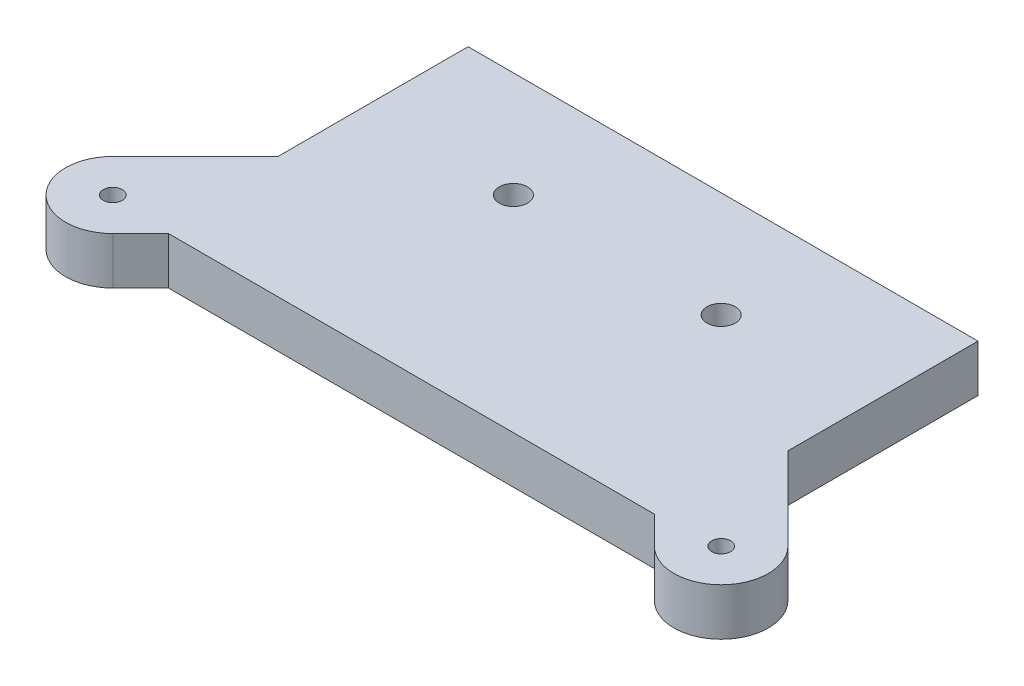
ISO-10303-21;
HEADER;
FILE_DESCRIPTION(('STEP AP214'),'2;1');
FILE_NAME('part.step','',(''),(''),'','','');
FILE_SCHEMA(('AUTOMOTIVE_DESIGN { 1 0 10303 214 1 1 1 1 }'));
ENDSEC;
DATA;
#1=APPLICATION_CONTEXT('core data for automotive mechanical design processes');
#2=APPLICATION_PROTOCOL_DEFINITION('international standard','automotive_design',2000,#1);
#3=PRODUCT_CONTEXT('',#1,'mechanical');
#4=PRODUCT('Part','Part','',(#3));
#5=PRODUCT_RELATED_PRODUCT_CATEGORY('part','',(#4));
#6=PRODUCT_DEFINITION_FORMATION('','',#4);
#7=PRODUCT_DEFINITION_CONTEXT('part definition',#1,'design');
#8=PRODUCT_DEFINITION('design','',#6,#7);
#9=PRODUCT_DEFINITION_SHAPE('','',#8);
#10=(LENGTH_UNIT() NAMED_UNIT(*) SI_UNIT(.MILLI.,.METRE.));
#11=(NAMED_UNIT(*) PLANE_ANGLE_UNIT() SI_UNIT($,.RADIAN.));
#12=(NAMED_UNIT(*) SI_UNIT($,.STERADIAN.) SOLID_ANGLE_UNIT());
#13=UNCERTAINTY_MEASURE_WITH_UNIT(LENGTH_MEASURE(1.E-05),#10,'distance_accuracy_value','');
#14=(GEOMETRIC_REPRESENTATION_CONTEXT(3) GLOBAL_UNCERTAINTY_ASSIGNED_CONTEXT((#13)) GLOBAL_UNIT_ASSIGNED_CONTEXT((#10,
#11,#12)) REPRESENTATION_CONTEXT('',''));
#15=CARTESIAN_POINT('',(0.,0.,0.));
#16=DIRECTION('',(0.,0.,1.));
#17=DIRECTION('',(1.,0.,0.));
#18=AXIS2_PLACEMENT_3D('',#15,#16,#17);
#19=CARTESIAN_POINT('',(0.,5.,0.));
#20=DIRECTION('',(1.,0.,0.));
#21=DIRECTION('',(0.,0.,-1.));
#22=AXIS2_PLACEMENT_3D('',#19,#20,#21);
#23=PLANE('',#22);
#24=DIRECTION('',(0.,0.,1.));
#25=VECTOR('',#24,1.);
#26=CARTESIAN_POINT('',(0.,0.,0.));
#27=LINE('',#26,#25);
#28=CARTESIAN_POINT('',(0.,0.,-33.));
#29=VERTEX_POINT('',#28);
#30=CARTESIAN_POINT('',(0.,0.,-12.8710678118655));
#31=VERTEX_POINT('',#30);
#32=EDGE_CURVE('E201',#29,#31,#27,.T.);
#33=ORIENTED_EDGE('',*,*,#32,.T.);
#34=DIRECTION('',(0.,-1.,0.));
#35=VECTOR('',#34,1.);
#36=CARTESIAN_POINT('',(0.,5.,-12.8710678118655));
#37=LINE('',#36,#35);
#38=CARTESIAN_POINT('',(0.,5.,-12.8710678118655));
#39=VERTEX_POINT('',#38);
#40=EDGE_CURVE('E205',#39,#31,#37,.T.);
#41=ORIENTED_EDGE('',*,*,#40,.F.);
#42=DIRECTION('',(0.,0.,1.));
#43=VECTOR('',#42,1.);
#44=CARTESIAN_POINT('',(0.,5.,0.));
#45=LINE('',#44,#43);
#46=CARTESIAN_POINT('',(0.,5.,-33.));
#47=VERTEX_POINT('',#46);
#48=EDGE_CURVE('E211',#47,#39,#45,.T.);
#49=ORIENTED_EDGE('',*,*,#48,.F.);
#50=DIRECTION('',(0.,-1.,0.));
#51=VECTOR('',#50,1.);
#52=CARTESIAN_POINT('',(0.,5.,-33.));
#53=LINE('',#52,#51);
#54=EDGE_CURVE('E47',#47,#29,#53,.T.);
#55=ORIENTED_EDGE('',*,*,#54,.T.);
#56=EDGE_LOOP('',(#33,#41,#49,#55));
#57=FACE_BOUND('',#56,.T.);
#58=ADVANCED_FACE('F39',(#57),#23,.F.);
#59=CARTESIAN_POINT('',(0.,5.,0.));
#60=DIRECTION('',(0.,0.,-1.));
#61=DIRECTION('',(-1.,0.,0.));
#62=AXIS2_PLACEMENT_3D('',#59,#60,#61);
#63=PLANE('',#62);
#64=DIRECTION('',(1.,0.,0.));
#65=VECTOR('',#64,1.);
#66=CARTESIAN_POINT('',(0.,0.,0.));
#67=LINE('',#66,#65);
#68=CARTESIAN_POINT('',(1.27106781186554,0.,0.));
#69=VERTEX_POINT('',#68);
#70=CARTESIAN_POINT('',(52.7289321881347,0.,0.));
#71=VERTEX_POINT('',#70);
#72=EDGE_CURVE('E226',#69,#71,#67,.T.);
#73=ORIENTED_EDGE('',*,*,#72,.T.);
#74=DIRECTION('',(0.,-1.,0.));
#75=VECTOR('',#74,1.);
#76=CARTESIAN_POINT('',(52.7289321881347,5.,0.));
#77=LINE('',#76,#75);
#78=CARTESIAN_POINT('',(52.7289321881347,5.,0.));
#79=VERTEX_POINT('',#78);
#80=EDGE_CURVE('E62',#79,#71,#77,.T.);
#81=ORIENTED_EDGE('',*,*,#80,.F.);
#82=DIRECTION('',(1.,0.,0.));
#83=VECTOR('',#82,1.);
#84=CARTESIAN_POINT('',(0.,5.,0.));
#85=LINE('',#84,#83);
#86=CARTESIAN_POINT('',(1.27106781186554,5.,0.));
#87=VERTEX_POINT('',#86);
#88=EDGE_CURVE('E215',#87,#79,#85,.T.);
#89=ORIENTED_EDGE('',*,*,#88,.F.);
#90=DIRECTION('',(0.,-1.,0.));
#91=VECTOR('',#90,1.);
#92=CARTESIAN_POINT('',(1.27106781186554,5.,0.));
#93=LINE('',#92,#91);
#94=EDGE_CURVE('E202',#87,#69,#93,.T.);
#95=ORIENTED_EDGE('',*,*,#94,.T.);
#96=EDGE_LOOP('',(#73,#81,#89,#95));
#97=FACE_BOUND('',#96,.T.);
#98=ADVANCED_FACE('F271',(#97),#63,.F.);
#99=CARTESIAN_POINT('',(54.,5.,0.));
#100=DIRECTION('',(-1.,0.,0.));
#101=DIRECTION('',(0.,0.,1.));
#102=AXIS2_PLACEMENT_3D('',#99,#100,#101);
#103=PLANE('',#102);
#104=DIRECTION('',(0.,0.,-1.));
#105=VECTOR('',#104,1.);
#106=CARTESIAN_POINT('',(54.,5.,0.));
#107=LINE('',#106,#105);
#108=CARTESIAN_POINT('',(54.,5.,-12.8710678118657));
#109=VERTEX_POINT('',#108);
#110=CARTESIAN_POINT('',(54.,5.,-33.));
#111=VERTEX_POINT('',#110);
#112=EDGE_CURVE('E54',#109,#111,#107,.T.);
#113=ORIENTED_EDGE('',*,*,#112,.F.);
#114=DIRECTION('',(0.,-1.,0.));
#115=VECTOR('',#114,1.);
#116=CARTESIAN_POINT('',(54.,5.,-12.8710678118657));
#117=LINE('',#116,#115);
#118=CARTESIAN_POINT('',(54.,0.,-12.8710678118657));
#119=VERTEX_POINT('',#118);
#120=EDGE_CURVE('E128',#109,#119,#117,.T.);
#121=ORIENTED_EDGE('',*,*,#120,.T.);
#122=DIRECTION('',(0.,0.,-1.));
#123=VECTOR('',#122,1.);
#124=CARTESIAN_POINT('',(54.,0.,0.));
#125=LINE('',#124,#123);
#126=CARTESIAN_POINT('',(54.,0.,-33.));
#127=VERTEX_POINT('',#126);
#128=EDGE_CURVE('E229',#119,#127,#125,.T.);
#129=ORIENTED_EDGE('',*,*,#128,.T.);
#130=DIRECTION('',(0.,-1.,0.));
#131=VECTOR('',#130,1.);
#132=CARTESIAN_POINT('',(54.,5.,-33.));
#133=LINE('',#132,#131);
#134=EDGE_CURVE('E11',#111,#127,#133,.T.);
#135=ORIENTED_EDGE('',*,*,#134,.F.);
#136=EDGE_LOOP('',(#113,#121,#129,#135));
#137=FACE_BOUND('',#136,.T.);
#138=ADVANCED_FACE('F253',(#137),#103,.F.);
#139=CARTESIAN_POINT('',(0.,5.,-33.));
#140=DIRECTION('',(0.,0.,1.));
#141=DIRECTION('',(1.,0.,0.));
#142=AXIS2_PLACEMENT_3D('',#139,#140,#141);
#143=PLANE('',#142);
#144=DIRECTION('',(-1.,0.,0.));
#145=VECTOR('',#144,1.);
#146=CARTESIAN_POINT('',(0.,0.,-33.));
#147=LINE('',#146,#145);
#148=EDGE_CURVE('E216',#127,#29,#147,.T.);
#149=ORIENTED_EDGE('',*,*,#148,.T.);
#150=ORIENTED_EDGE('',*,*,#54,.F.);
#151=DIRECTION('',(-1.,0.,0.));
#152=VECTOR('',#151,1.);
#153=CARTESIAN_POINT('',(0.,5.,-33.));
#154=LINE('',#153,#152);
#155=EDGE_CURVE('E221',#111,#47,#154,.T.);
#156=ORIENTED_EDGE('',*,*,#155,.F.);
#157=ORIENTED_EDGE('',*,*,#134,.T.);
#158=EDGE_LOOP('',(#149,#150,#156,#157));
#159=FACE_BOUND('',#158,.T.);
#160=ADVANCED_FACE('F252',(#159),#143,.F.);
#161=CARTESIAN_POINT('',(0.,5.,0.));
#162=DIRECTION('',(0.,-1.,0.));
#163=DIRECTION('',(0.,0.,-1.));
#164=AXIS2_PLACEMENT_3D('',#161,#162,#163);
#165=PLANE('',#164);
#166=CARTESIAN_POINT('',(38.,5.,-21.8));
#167=DIRECTION('',(0.,-1.,0.));
#168=DIRECTION('',(0.,0.,-1.));
#169=AXIS2_PLACEMENT_3D('',#166,#167,#168);
#170=CIRCLE('',#169,1.5);
#171=CARTESIAN_POINT('',(38.,5.,-23.3));
#172=VERTEX_POINT('',#171);
#173=EDGE_CURVE('E321',#172,#172,#170,.T.);
#174=ORIENTED_EDGE('',*,*,#173,.T.);
#175=EDGE_LOOP('',(#174));
#176=FACE_BOUND('',#175,.T.);
#177=CARTESIAN_POINT('',(16.,5.,-21.8));
#178=DIRECTION('',(0.,-1.,0.));
#179=DIRECTION('',(0.,0.,-1.));
#180=AXIS2_PLACEMENT_3D('',#177,#178,#179);
#181=CIRCLE('',#180,1.5);
#182=CARTESIAN_POINT('',(16.,5.,-23.3));
#183=VERTEX_POINT('',#182);
#184=EDGE_CURVE('E326',#183,#183,#181,.T.);
#185=ORIENTED_EDGE('',*,*,#184,.T.);
#186=EDGE_LOOP('',(#185));
#187=FACE_BOUND('',#186,.T.);
#188=DIRECTION('',(0.707106781186549,0.,0.707106781186547));
#189=VECTOR('',#188,1.);
#190=CARTESIAN_POINT('',(62.7487373415293,5.,-4.12233047033644));
#191=LINE('',#190,#189);
#192=CARTESIAN_POINT('',(62.7487373415293,5.,-4.12233047033644));
#193=VERTEX_POINT('',#192);
#194=EDGE_CURVE('E135',#109,#193,#191,.T.);
#195=ORIENTED_EDGE('',*,*,#194,.F.);
#196=ORIENTED_EDGE('',*,*,#112,.T.);
#197=ORIENTED_EDGE('',*,*,#155,.T.);
#198=ORIENTED_EDGE('',*,*,#48,.T.);
#199=DIRECTION('',(0.707106781186544,0.,-0.707106781186551));
#200=VECTOR('',#199,1.);
#201=CARTESIAN_POINT('',(-8.74873734152914,5.,-4.12233047033624));
#202=LINE('',#201,#200);
#203=CARTESIAN_POINT('',(-8.74873734152914,5.,-4.12233047033624));
#204=VERTEX_POINT('',#203);
#205=EDGE_CURVE('E178',#204,#39,#202,.T.);
#206=ORIENTED_EDGE('',*,*,#205,.F.);
#207=CARTESIAN_POINT('',(-5.21320343559638,5.,-0.586796564403524));
#208=DIRECTION('',(0.,-1.,0.));
#209=DIRECTION('',(0.,0.,-1.));
#210=AXIS2_PLACEMENT_3D('',#207,#208,#209);
#211=CIRCLE('',#210,5.);
#212=CARTESIAN_POINT('',(-1.67766952966347,5.,2.94873734152904));
#213=VERTEX_POINT('',#212);
#214=EDGE_CURVE('E174',#213,#204,#211,.T.);
#215=ORIENTED_EDGE('',*,*,#214,.F.);
#216=DIRECTION('',(-0.707106781186544,0.,0.707106781186551));
#217=VECTOR('',#216,1.);
#218=CARTESIAN_POINT('',(-1.67766952966347,5.,2.94873734152904));
#219=LINE('',#218,#217);
#220=EDGE_CURVE('E183',#87,#213,#219,.T.);
#221=ORIENTED_EDGE('',*,*,#220,.F.);
#222=ORIENTED_EDGE('',*,*,#88,.T.);
#223=DIRECTION('',(-0.70710678118655,0.,-0.707106781186545));
#224=VECTOR('',#223,1.);
#225=CARTESIAN_POINT('',(55.6776695296638,5.,2.94873734152904));
#226=LINE('',#225,#224);
#227=CARTESIAN_POINT('',(55.6776695296638,5.,2.94873734152904));
#228=VERTEX_POINT('',#227);
#229=EDGE_CURVE('E137',#228,#79,#226,.T.);
#230=ORIENTED_EDGE('',*,*,#229,.F.);
#231=CARTESIAN_POINT('',(59.2132034355965,5.,-0.586796564403698));
#232=DIRECTION('',(0.,-1.,0.));
#233=DIRECTION('',(0.,0.,-1.));
#234=AXIS2_PLACEMENT_3D('',#231,#232,#233);
#235=CIRCLE('',#234,4.99999999999999);
#236=EDGE_CURVE('E119',#193,#228,#235,.T.);
#237=ORIENTED_EDGE('',*,*,#236,.F.);
#238=EDGE_LOOP('',(#195,#196,#197,#198,#206,#215,#221,#222,#230,#237));
#239=FACE_BOUND('',#238,.T.);
#240=CARTESIAN_POINT('',(-5.21320343559638,5.,-0.586796564403524));
#241=DIRECTION('',(0.,-1.,0.));
#242=DIRECTION('',(0.,0.,-1.));
#243=AXIS2_PLACEMENT_3D('',#240,#241,#242);
#244=CIRCLE('',#243,1.);
#245=CARTESIAN_POINT('',(-5.21320343559638,5.,-1.58679656440352));
#246=VERTEX_POINT('',#245);
#247=EDGE_CURVE('E166',#246,#246,#244,.T.);
#248=ORIENTED_EDGE('',*,*,#247,.T.);
#249=EDGE_LOOP('',(#248));
#250=FACE_BOUND('',#249,.T.);
#251=CARTESIAN_POINT('',(59.2132034355965,5.,-0.586796564403698));
#252=DIRECTION('',(0.,-1.,0.));
#253=DIRECTION('',(0.,0.,-1.));
#254=AXIS2_PLACEMENT_3D('',#251,#252,#253);
#255=CIRCLE('',#254,0.999999999999998);
#256=CARTESIAN_POINT('',(59.2132034355965,5.,-1.5867965644037));
#257=VERTEX_POINT('',#256);
#258=EDGE_CURVE('E156',#257,#257,#255,.T.);
#259=ORIENTED_EDGE('',*,*,#258,.T.);
#260=EDGE_LOOP('',(#259));
#261=FACE_BOUND('',#260,.T.);
#262=ADVANCED_FACE('F133',(#176,#187,#239,#250,#261),#165,.F.);
#263=CARTESIAN_POINT('',(0.,0.,0.));
#264=DIRECTION('',(0.,-1.,0.));
#265=DIRECTION('',(0.,0.,-1.));
#266=AXIS2_PLACEMENT_3D('',#263,#264,#265);
#267=PLANE('',#266);
#268=CARTESIAN_POINT('',(38.,0.,-21.8));
#269=DIRECTION('',(0.,-1.,0.));
#270=DIRECTION('',(0.,0.,-1.));
#271=AXIS2_PLACEMENT_3D('',#268,#269,#270);
#272=CIRCLE('',#271,1.5);
#273=CARTESIAN_POINT('',(38.,0.,-23.3));
#274=VERTEX_POINT('',#273);
#275=EDGE_CURVE('E324',#274,#274,#272,.T.);
#276=ORIENTED_EDGE('',*,*,#275,.F.);
#277=EDGE_LOOP('',(#276));
#278=FACE_BOUND('',#277,.T.);
#279=CARTESIAN_POINT('',(16.,0.,-21.8));
#280=DIRECTION('',(0.,-1.,0.));
#281=DIRECTION('',(0.,0.,-1.));
#282=AXIS2_PLACEMENT_3D('',#279,#280,#281);
#283=CIRCLE('',#282,1.5);
#284=CARTESIAN_POINT('',(16.,0.,-23.3));
#285=VERTEX_POINT('',#284);
#286=EDGE_CURVE('E332',#285,#285,#283,.T.);
#287=ORIENTED_EDGE('',*,*,#286,.F.);
#288=EDGE_LOOP('',(#287));
#289=FACE_BOUND('',#288,.T.);
#290=ORIENTED_EDGE('',*,*,#128,.F.);
#291=DIRECTION('',(0.707106781186549,0.,0.707106781186547));
#292=VECTOR('',#291,1.);
#293=CARTESIAN_POINT('',(62.7487373415293,0.,-4.12233047033644));
#294=LINE('',#293,#292);
#295=CARTESIAN_POINT('',(62.7487373415293,0.,-4.12233047033644));
#296=VERTEX_POINT('',#295);
#297=EDGE_CURVE('E153',#119,#296,#294,.T.);
#298=ORIENTED_EDGE('',*,*,#297,.T.);
#299=CARTESIAN_POINT('',(59.2132034355965,0.,-0.586796564403698));
#300=DIRECTION('',(0.,-1.,0.));
#301=DIRECTION('',(0.,0.,-1.));
#302=AXIS2_PLACEMENT_3D('',#299,#300,#301);
#303=CIRCLE('',#302,4.99999999999999);
#304=CARTESIAN_POINT('',(55.6776695296638,0.,2.94873734152904));
#305=VERTEX_POINT('',#304);
#306=EDGE_CURVE('E121',#296,#305,#303,.T.);
#307=ORIENTED_EDGE('',*,*,#306,.T.);
#308=DIRECTION('',(-0.70710678118655,0.,-0.707106781186545));
#309=VECTOR('',#308,1.);
#310=CARTESIAN_POINT('',(55.6776695296638,0.,2.94873734152904));
#311=LINE('',#310,#309);
#312=EDGE_CURVE('E142',#305,#71,#311,.T.);
#313=ORIENTED_EDGE('',*,*,#312,.T.);
#314=ORIENTED_EDGE('',*,*,#72,.F.);
#315=DIRECTION('',(-0.707106781186544,0.,0.707106781186551));
#316=VECTOR('',#315,1.);
#317=CARTESIAN_POINT('',(-1.67766952966347,0.,2.94873734152904));
#318=LINE('',#317,#316);
#319=CARTESIAN_POINT('',(-1.67766952966347,0.,2.94873734152904));
#320=VERTEX_POINT('',#319);
#321=EDGE_CURVE('E179',#69,#320,#318,.T.);
#322=ORIENTED_EDGE('',*,*,#321,.T.);
#323=CARTESIAN_POINT('',(-5.21320343559638,0.,-0.586796564403524));
#324=DIRECTION('',(0.,-1.,0.));
#325=DIRECTION('',(0.,0.,-1.));
#326=AXIS2_PLACEMENT_3D('',#323,#324,#325);
#327=CIRCLE('',#326,5.);
#328=CARTESIAN_POINT('',(-8.74873734152914,0.,-4.12233047033624));
#329=VERTEX_POINT('',#328);
#330=EDGE_CURVE('E170',#320,#329,#327,.T.);
#331=ORIENTED_EDGE('',*,*,#330,.T.);
#332=DIRECTION('',(0.707106781186544,0.,-0.707106781186551));
#333=VECTOR('',#332,1.);
#334=CARTESIAN_POINT('',(-8.74873734152914,0.,-4.12233047033624));
#335=LINE('',#334,#333);
#336=EDGE_CURVE('E191',#329,#31,#335,.T.);
#337=ORIENTED_EDGE('',*,*,#336,.T.);
#338=ORIENTED_EDGE('',*,*,#32,.F.);
#339=ORIENTED_EDGE('',*,*,#148,.F.);
#340=EDGE_LOOP('',(#290,#298,#307,#313,#314,#322,#331,#337,#338,#339));
#341=FACE_BOUND('',#340,.T.);
#342=CARTESIAN_POINT('',(-5.21320343559638,0.,-0.586796564403524));
#343=DIRECTION('',(0.,-1.,0.));
#344=DIRECTION('',(0.,0.,-1.));
#345=AXIS2_PLACEMENT_3D('',#342,#343,#344);
#346=CIRCLE('',#345,1.);
#347=CARTESIAN_POINT('',(-5.21320343559638,0.,-1.58679656440352));
#348=VERTEX_POINT('',#347);
#349=EDGE_CURVE('E161',#348,#348,#346,.T.);
#350=ORIENTED_EDGE('',*,*,#349,.F.);
#351=EDGE_LOOP('',(#350));
#352=FACE_BOUND('',#351,.T.);
#353=CARTESIAN_POINT('',(59.2132034355965,0.,-0.586796564403698));
#354=DIRECTION('',(0.,-1.,0.));
#355=DIRECTION('',(0.,0.,-1.));
#356=AXIS2_PLACEMENT_3D('',#353,#354,#355);
#357=CIRCLE('',#356,0.999999999999998);
#358=CARTESIAN_POINT('',(59.2132034355965,0.,-1.5867965644037));
#359=VERTEX_POINT('',#358);
#360=EDGE_CURVE('E148',#359,#359,#357,.T.);
#361=ORIENTED_EDGE('',*,*,#360,.F.);
#362=EDGE_LOOP('',(#361));
#363=FACE_BOUND('',#362,.T.);
#364=ADVANCED_FACE('F244',(#278,#289,#341,#352,#363),#267,.T.);
#365=CARTESIAN_POINT('',(-5.21320343559638,5.,-0.586796564403524));
#366=DIRECTION('',(0.,-1.,0.));
#367=DIRECTION('',(0.,0.,-1.));
#368=AXIS2_PLACEMENT_3D('',#365,#366,#367);
#369=CYLINDRICAL_SURFACE('',#368,5.);
#370=ORIENTED_EDGE('',*,*,#330,.F.);
#371=DIRECTION('',(0.,-1.,0.));
#372=VECTOR('',#371,1.);
#373=CARTESIAN_POINT('',(-1.67766952966347,5.,2.94873734152904));
#374=LINE('',#373,#372);
#375=EDGE_CURVE('E198',#213,#320,#374,.T.);
#376=ORIENTED_EDGE('',*,*,#375,.F.);
#377=ORIENTED_EDGE('',*,*,#214,.T.);
#378=DIRECTION('',(0.,-1.,0.));
#379=VECTOR('',#378,1.);
#380=CARTESIAN_POINT('',(-8.74873734152914,5.,-4.12233047033624));
#381=LINE('',#380,#379);
#382=EDGE_CURVE('E187',#204,#329,#381,.T.);
#383=ORIENTED_EDGE('',*,*,#382,.T.);
#384=EDGE_LOOP('',(#370,#376,#377,#383));
#385=FACE_BOUND('',#384,.T.);
#386=ADVANCED_FACE('F284',(#385),#369,.T.);
#387=CARTESIAN_POINT('',(-1.67766952966347,5.,2.94873734152904));
#388=DIRECTION('',(0.707106781186551,0.,0.707106781186544));
#389=DIRECTION('',(0.707106781186544,0.,-0.707106781186551));
#390=AXIS2_PLACEMENT_3D('',#387,#388,#389);
#391=PLANE('',#390);
#392=ORIENTED_EDGE('',*,*,#321,.F.);
#393=ORIENTED_EDGE('',*,*,#94,.F.);
#394=ORIENTED_EDGE('',*,*,#220,.T.);
#395=ORIENTED_EDGE('',*,*,#375,.T.);
#396=EDGE_LOOP('',(#392,#393,#394,#395));
#397=FACE_BOUND('',#396,.T.);
#398=ADVANCED_FACE('F291',(#397),#391,.T.);
#399=CARTESIAN_POINT('',(-8.74873734152914,5.,-4.12233047033624));
#400=DIRECTION('',(-0.707106781186551,0.,-0.707106781186544));
#401=DIRECTION('',(-0.707106781186544,0.,0.707106781186551));
#402=AXIS2_PLACEMENT_3D('',#399,#400,#401);
#403=PLANE('',#402);
#404=ORIENTED_EDGE('',*,*,#336,.F.);
#405=ORIENTED_EDGE('',*,*,#382,.F.);
#406=ORIENTED_EDGE('',*,*,#205,.T.);
#407=ORIENTED_EDGE('',*,*,#40,.T.);
#408=EDGE_LOOP('',(#404,#405,#406,#407));
#409=FACE_BOUND('',#408,.T.);
#410=ADVANCED_FACE('F249',(#409),#403,.T.);
#411=CARTESIAN_POINT('',(-5.21320343559638,5.,-0.586796564403524));
#412=DIRECTION('',(0.,-1.,0.));
#413=DIRECTION('',(0.,0.,-1.));
#414=AXIS2_PLACEMENT_3D('',#411,#412,#413);
#415=CYLINDRICAL_SURFACE('',#414,1.);
#416=ORIENTED_EDGE('',*,*,#247,.F.);
#417=EDGE_LOOP('',(#416));
#418=FACE_BOUND('',#417,.T.);
#419=ORIENTED_EDGE('',*,*,#349,.T.);
#420=EDGE_LOOP('',(#419));
#421=FACE_BOUND('',#420,.T.);
#422=ADVANCED_FACE('F260',(#418,#421),#415,.F.);
#423=CARTESIAN_POINT('',(55.6776695296638,5.,2.94873734152904));
#424=DIRECTION('',(-0.707106781186545,0.,0.70710678118655));
#425=DIRECTION('',(0.70710678118655,0.,0.707106781186545));
#426=AXIS2_PLACEMENT_3D('',#423,#424,#425);
#427=PLANE('',#426);
#428=ORIENTED_EDGE('',*,*,#312,.F.);
#429=DIRECTION('',(0.,-1.,0.));
#430=VECTOR('',#429,1.);
#431=CARTESIAN_POINT('',(55.6776695296638,5.,2.94873734152904));
#432=LINE('',#431,#430);
#433=EDGE_CURVE('E127',#228,#305,#432,.T.);
#434=ORIENTED_EDGE('',*,*,#433,.F.);
#435=ORIENTED_EDGE('',*,*,#229,.T.);
#436=ORIENTED_EDGE('',*,*,#80,.T.);
#437=EDGE_LOOP('',(#428,#434,#435,#436));
#438=FACE_BOUND('',#437,.T.);
#439=ADVANCED_FACE('F258',(#438),#427,.T.);
#440=CARTESIAN_POINT('',(59.2132034355965,5.,-0.586796564403698));
#441=DIRECTION('',(0.,-1.,0.));
#442=DIRECTION('',(0.,0.,-1.));
#443=AXIS2_PLACEMENT_3D('',#440,#441,#442);
#444=CYLINDRICAL_SURFACE('',#443,4.99999999999999);
#445=ORIENTED_EDGE('',*,*,#306,.F.);
#446=DIRECTION('',(0.,-1.,0.));
#447=VECTOR('',#446,1.);
#448=CARTESIAN_POINT('',(62.7487373415293,5.,-4.12233047033644));
#449=LINE('',#448,#447);
#450=EDGE_CURVE('E116',#193,#296,#449,.T.);
#451=ORIENTED_EDGE('',*,*,#450,.F.);
#452=ORIENTED_EDGE('',*,*,#236,.T.);
#453=ORIENTED_EDGE('',*,*,#433,.T.);
#454=EDGE_LOOP('',(#445,#451,#452,#453));
#455=FACE_BOUND('',#454,.T.);
#456=ADVANCED_FACE('F118',(#455),#444,.T.);
#457=CARTESIAN_POINT('',(62.7487373415293,5.,-4.12233047033644));
#458=DIRECTION('',(0.707106781186547,0.,-0.707106781186549));
#459=DIRECTION('',(-0.707106781186549,0.,-0.707106781186547));
#460=AXIS2_PLACEMENT_3D('',#457,#458,#459);
#461=PLANE('',#460);
#462=ORIENTED_EDGE('',*,*,#297,.F.);
#463=ORIENTED_EDGE('',*,*,#120,.F.);
#464=ORIENTED_EDGE('',*,*,#194,.T.);
#465=ORIENTED_EDGE('',*,*,#450,.T.);
#466=EDGE_LOOP('',(#462,#463,#464,#465));
#467=FACE_BOUND('',#466,.T.);
#468=ADVANCED_FACE('F140',(#467),#461,.T.);
#469=CARTESIAN_POINT('',(59.2132034355965,5.,-0.586796564403698));
#470=DIRECTION('',(0.,-1.,0.));
#471=DIRECTION('',(0.,0.,-1.));
#472=AXIS2_PLACEMENT_3D('',#469,#470,#471);
#473=CYLINDRICAL_SURFACE('',#472,0.999999999999998);
#474=ORIENTED_EDGE('',*,*,#258,.F.);
#475=EDGE_LOOP('',(#474));
#476=FACE_BOUND('',#475,.T.);
#477=ORIENTED_EDGE('',*,*,#360,.T.);
#478=EDGE_LOOP('',(#477));
#479=FACE_BOUND('',#478,.T.);
#480=ADVANCED_FACE('F299',(#476,#479),#473,.F.);
#481=CARTESIAN_POINT('',(16.,5.,-21.8));
#482=DIRECTION('',(0.,-1.,0.));
#483=DIRECTION('',(0.,0.,-1.));
#484=AXIS2_PLACEMENT_3D('',#481,#482,#483);
#485=CYLINDRICAL_SURFACE('',#484,1.5);
#486=ORIENTED_EDGE('',*,*,#184,.F.);
#487=EDGE_LOOP('',(#486));
#488=FACE_BOUND('',#487,.T.);
#489=ORIENTED_EDGE('',*,*,#286,.T.);
#490=EDGE_LOOP('',(#489));
#491=FACE_BOUND('',#490,.T.);
#492=ADVANCED_FACE('F303',(#488,#491),#485,.F.);
#493=CARTESIAN_POINT('',(38.,5.,-21.8));
#494=DIRECTION('',(0.,-1.,0.));
#495=DIRECTION('',(0.,0.,-1.));
#496=AXIS2_PLACEMENT_3D('',#493,#494,#495);
#497=CYLINDRICAL_SURFACE('',#496,1.5);
#498=ORIENTED_EDGE('',*,*,#173,.F.);
#499=EDGE_LOOP('',(#498));
#500=FACE_BOUND('',#499,.T.);
#501=ORIENTED_EDGE('',*,*,#275,.T.);
#502=EDGE_LOOP('',(#501));
#503=FACE_BOUND('',#502,.T.);
#504=ADVANCED_FACE('F308',(#500,#503),#497,.F.);
#505=CLOSED_SHELL('',(#58,#98,#138,#160,#262,#364,#386,#398,#410,#422,#439,#456,#468,#480,#492,#504));
#506=MANIFOLD_SOLID_BREP('B2',#505);
#507=ADVANCED_BREP_SHAPE_REPRESENTATION('',(#18,#506),#14);
#508=SHAPE_DEFINITION_REPRESENTATION(#9,#507);
ENDSEC;
END-ISO-10303-21;
